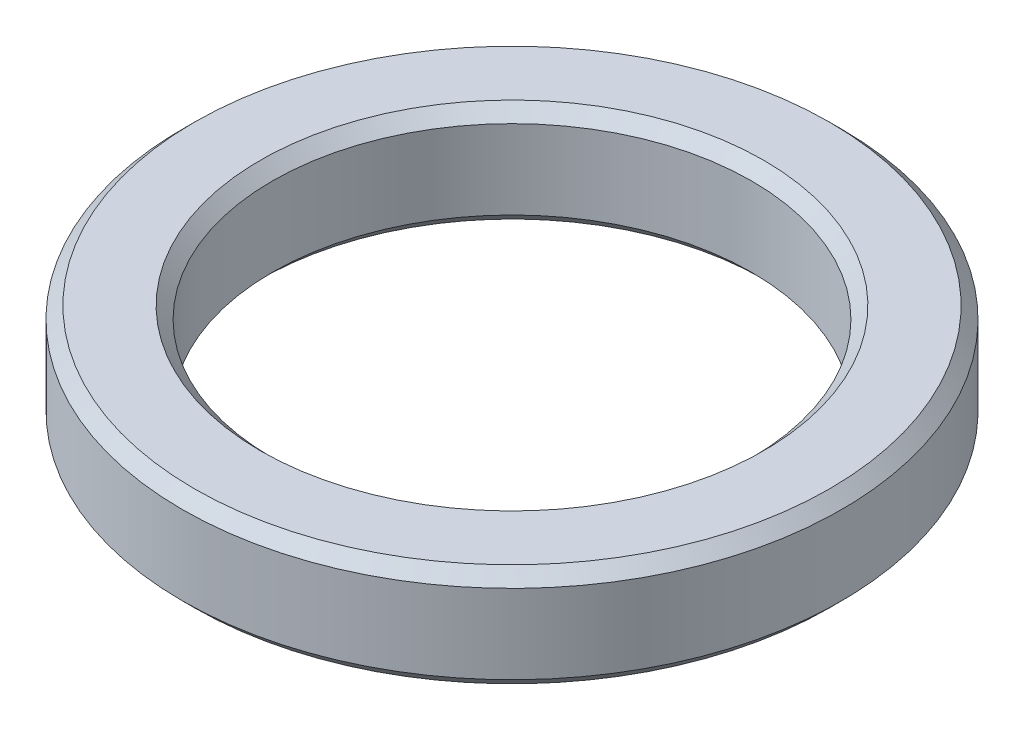
ISO-10303-21;
HEADER;
FILE_DESCRIPTION(('STEP AP214'),'2;1');
FILE_NAME('part.step','',(''),(''),'','','');
FILE_SCHEMA(('AUTOMOTIVE_DESIGN { 1 0 10303 214 1 1 1 1 }'));
ENDSEC;
DATA;
#1=APPLICATION_CONTEXT('core data for automotive mechanical design processes');
#2=APPLICATION_PROTOCOL_DEFINITION('international standard','automotive_design',2000,#1);
#3=PRODUCT_CONTEXT('',#1,'mechanical');
#4=PRODUCT('Part','Part','',(#3));
#5=PRODUCT_RELATED_PRODUCT_CATEGORY('part','',(#4));
#6=PRODUCT_DEFINITION_FORMATION('','',#4);
#7=PRODUCT_DEFINITION_CONTEXT('part definition',#1,'design');
#8=PRODUCT_DEFINITION('design','',#6,#7);
#9=PRODUCT_DEFINITION_SHAPE('','',#8);
#10=(LENGTH_UNIT() NAMED_UNIT(*) SI_UNIT(.MILLI.,.METRE.));
#11=(NAMED_UNIT(*) PLANE_ANGLE_UNIT() SI_UNIT($,.RADIAN.));
#12=(NAMED_UNIT(*) SI_UNIT($,.STERADIAN.) SOLID_ANGLE_UNIT());
#13=UNCERTAINTY_MEASURE_WITH_UNIT(LENGTH_MEASURE(1.E-05),#10,'distance_accuracy_value','');
#14=(GEOMETRIC_REPRESENTATION_CONTEXT(3) GLOBAL_UNCERTAINTY_ASSIGNED_CONTEXT((#13)) GLOBAL_UNIT_ASSIGNED_CONTEXT((#10,
#11,#12)) REPRESENTATION_CONTEXT('',''));
#15=CARTESIAN_POINT('',(0.,0.,0.));
#16=DIRECTION('',(0.,0.,1.));
#17=DIRECTION('',(1.,0.,0.));
#18=AXIS2_PLACEMENT_3D('',#15,#16,#17);
#19=CARTESIAN_POINT('',(0.,0.86,0.));
#20=DIRECTION('',(0.,1.,0.));
#21=DIRECTION('',(0.,0.,1.));
#22=AXIS2_PLACEMENT_3D('',#19,#20,#21);
#23=PLANE('',#22);
#24=CARTESIAN_POINT('',(0.,0.86,0.));
#25=DIRECTION('',(0.,1.,0.));
#26=DIRECTION('',(0.,0.,1.));
#27=AXIS2_PLACEMENT_3D('',#24,#25,#26);
#28=CIRCLE('',#27,2.1);
#29=CARTESIAN_POINT('',(0.,0.86,2.1));
#30=VERTEX_POINT('',#29);
#31=EDGE_CURVE('E10',#30,#30,#28,.F.);
#32=ORIENTED_EDGE('',*,*,#31,.T.);
#33=EDGE_LOOP('',(#32));
#34=FACE_BOUND('',#33,.T.);
#35=CARTESIAN_POINT('',(0.,0.86,0.));
#36=DIRECTION('',(0.,1.,0.));
#37=DIRECTION('',(0.,0.,1.));
#38=AXIS2_PLACEMENT_3D('',#35,#36,#37);
#39=CIRCLE('',#38,2.65);
#40=CARTESIAN_POINT('',(0.,0.86,2.65));
#41=VERTEX_POINT('',#40);
#42=EDGE_CURVE('E41',#41,#41,#39,.T.);
#43=ORIENTED_EDGE('',*,*,#42,.T.);
#44=EDGE_LOOP('',(#43));
#45=FACE_BOUND('',#44,.T.);
#46=ADVANCED_FACE('F34',(#34,#45),#23,.T.);
#47=CARTESIAN_POINT('',(0.,0.,0.));
#48=DIRECTION('',(0.,1.,0.));
#49=DIRECTION('',(0.,0.,1.));
#50=AXIS2_PLACEMENT_3D('',#47,#48,#49);
#51=PLANE('',#50);
#52=CARTESIAN_POINT('',(0.,0.,0.));
#53=DIRECTION('',(0.,1.,0.));
#54=DIRECTION('',(0.,0.,1.));
#55=AXIS2_PLACEMENT_3D('',#52,#53,#54);
#56=CIRCLE('',#55,2.1);
#57=CARTESIAN_POINT('',(0.,0.,2.1));
#58=VERTEX_POINT('',#57);
#59=EDGE_CURVE('E60',#58,#58,#56,.T.);
#60=ORIENTED_EDGE('',*,*,#59,.T.);
#61=EDGE_LOOP('',(#60));
#62=FACE_BOUND('',#61,.T.);
#63=CARTESIAN_POINT('',(0.,0.,0.));
#64=DIRECTION('',(0.,1.,0.));
#65=DIRECTION('',(0.,0.,1.));
#66=AXIS2_PLACEMENT_3D('',#63,#64,#65);
#67=CIRCLE('',#66,2.65);
#68=CARTESIAN_POINT('',(0.,0.,2.65));
#69=VERTEX_POINT('',#68);
#70=EDGE_CURVE('E63',#69,#69,#67,.F.);
#71=ORIENTED_EDGE('',*,*,#70,.T.);
#72=EDGE_LOOP('',(#71));
#73=FACE_BOUND('',#72,.T.);
#74=ADVANCED_FACE('F67',(#62,#73),#51,.F.);
#75=CARTESIAN_POINT('',(0.,0.86,0.));
#76=DIRECTION('',(0.,-1.,0.));
#77=DIRECTION('',(0.,0.,-1.));
#78=AXIS2_PLACEMENT_3D('',#75,#76,#77);
#79=CYLINDRICAL_SURFACE('',#78,2.75);
#80=CARTESIAN_POINT('',(0.,0.099999999999999,0.));
#81=DIRECTION('',(0.,1.,0.));
#82=DIRECTION('',(0.,0.,1.));
#83=AXIS2_PLACEMENT_3D('',#80,#81,#82);
#84=CIRCLE('',#83,2.75);
#85=CARTESIAN_POINT('',(0.,0.099999999999999,2.75));
#86=VERTEX_POINT('',#85);
#87=EDGE_CURVE('E45',#86,#86,#84,.T.);
#88=ORIENTED_EDGE('',*,*,#87,.T.);
#89=EDGE_LOOP('',(#88));
#90=FACE_BOUND('',#89,.T.);
#91=CARTESIAN_POINT('',(0.,0.76,0.));
#92=DIRECTION('',(0.,1.,0.));
#93=DIRECTION('',(0.,0.,1.));
#94=AXIS2_PLACEMENT_3D('',#91,#92,#93);
#95=CIRCLE('',#94,2.75);
#96=CARTESIAN_POINT('',(0.,0.76,2.75));
#97=VERTEX_POINT('',#96);
#98=EDGE_CURVE('E49',#97,#97,#95,.F.);
#99=ORIENTED_EDGE('',*,*,#98,.T.);
#100=EDGE_LOOP('',(#99));
#101=FACE_BOUND('',#100,.T.);
#102=ADVANCED_FACE('F77',(#90,#101),#79,.T.);
#103=CARTESIAN_POINT('',(0.,0.86,0.));
#104=DIRECTION('',(0.,-1.,0.));
#105=DIRECTION('',(0.,0.,-1.));
#106=AXIS2_PLACEMENT_3D('',#103,#104,#105);
#107=CYLINDRICAL_SURFACE('',#106,2.);
#108=CARTESIAN_POINT('',(0.,0.099999999999999,0.));
#109=DIRECTION('',(0.,1.,0.));
#110=DIRECTION('',(0.,0.,1.));
#111=AXIS2_PLACEMENT_3D('',#108,#109,#110);
#112=CIRCLE('',#111,2.);
#113=CARTESIAN_POINT('',(0.,0.099999999999999,2.));
#114=VERTEX_POINT('',#113);
#115=EDGE_CURVE('E54',#114,#114,#112,.F.);
#116=ORIENTED_EDGE('',*,*,#115,.T.);
#117=EDGE_LOOP('',(#116));
#118=FACE_BOUND('',#117,.T.);
#119=CARTESIAN_POINT('',(0.,0.760000000000001,0.));
#120=DIRECTION('',(0.,1.,0.));
#121=DIRECTION('',(0.,0.,1.));
#122=AXIS2_PLACEMENT_3D('',#119,#120,#121);
#123=CIRCLE('',#122,2.);
#124=CARTESIAN_POINT('',(0.,0.760000000000001,2.));
#125=VERTEX_POINT('',#124);
#126=EDGE_CURVE('E57',#125,#125,#123,.T.);
#127=ORIENTED_EDGE('',*,*,#126,.T.);
#128=EDGE_LOOP('',(#127));
#129=FACE_BOUND('',#128,.T.);
#130=ADVANCED_FACE('F80',(#118,#129),#107,.F.);
#131=CARTESIAN_POINT('',(0.,0.,0.));
#132=DIRECTION('',(0.,-1.,0.));
#133=DIRECTION('',(0.,0.,-1.));
#134=AXIS2_PLACEMENT_3D('',#131,#132,#133);
#135=CONICAL_SURFACE('',#134,2.1,0.785398163397448);
#136=ORIENTED_EDGE('',*,*,#115,.F.);
#137=EDGE_LOOP('',(#136));
#138=FACE_BOUND('',#137,.T.);
#139=ORIENTED_EDGE('',*,*,#59,.F.);
#140=EDGE_LOOP('',(#139));
#141=FACE_BOUND('',#140,.T.);
#142=ADVANCED_FACE('F73',(#138,#141),#135,.F.);
#143=CARTESIAN_POINT('',(0.,0.099999999999999,0.));
#144=DIRECTION('',(0.,1.,0.));
#145=DIRECTION('',(0.,0.,1.));
#146=AXIS2_PLACEMENT_3D('',#143,#144,#145);
#147=CONICAL_SURFACE('',#146,2.75,0.78539816339745);
#148=ORIENTED_EDGE('',*,*,#70,.F.);
#149=EDGE_LOOP('',(#148));
#150=FACE_BOUND('',#149,.T.);
#151=ORIENTED_EDGE('',*,*,#87,.F.);
#152=EDGE_LOOP('',(#151));
#153=FACE_BOUND('',#152,.T.);
#154=ADVANCED_FACE('F69',(#150,#153),#147,.T.);
#155=CARTESIAN_POINT('',(0.,0.760000000000001,0.));
#156=DIRECTION('',(0.,1.,0.));
#157=DIRECTION('',(0.,0.,1.));
#158=AXIS2_PLACEMENT_3D('',#155,#156,#157);
#159=CONICAL_SURFACE('',#158,2.,0.785398163397448);
#160=ORIENTED_EDGE('',*,*,#31,.F.);
#161=EDGE_LOOP('',(#160));
#162=FACE_BOUND('',#161,.T.);
#163=ORIENTED_EDGE('',*,*,#126,.F.);
#164=EDGE_LOOP('',(#163));
#165=FACE_BOUND('',#164,.T.);
#166=ADVANCED_FACE('F72',(#162,#165),#159,.F.);
#167=CARTESIAN_POINT('',(0.,0.86,0.));
#168=DIRECTION('',(0.,-1.,0.));
#169=DIRECTION('',(0.,0.,-1.));
#170=AXIS2_PLACEMENT_3D('',#167,#168,#169);
#171=CONICAL_SURFACE('',#170,2.65,0.785398163397453);
#172=ORIENTED_EDGE('',*,*,#98,.F.);
#173=EDGE_LOOP('',(#172));
#174=FACE_BOUND('',#173,.T.);
#175=ORIENTED_EDGE('',*,*,#42,.F.);
#176=EDGE_LOOP('',(#175));
#177=FACE_BOUND('',#176,.T.);
#178=ADVANCED_FACE('F36',(#174,#177),#171,.T.);
#179=CLOSED_SHELL('',(#46,#74,#102,#130,#142,#154,#166,#178));
#180=MANIFOLD_SOLID_BREP('B2',#179);
#181=ADVANCED_BREP_SHAPE_REPRESENTATION('',(#18,#180),#14);
#182=SHAPE_DEFINITION_REPRESENTATION(#9,#181);
ENDSEC;
END-ISO-10303-21;
